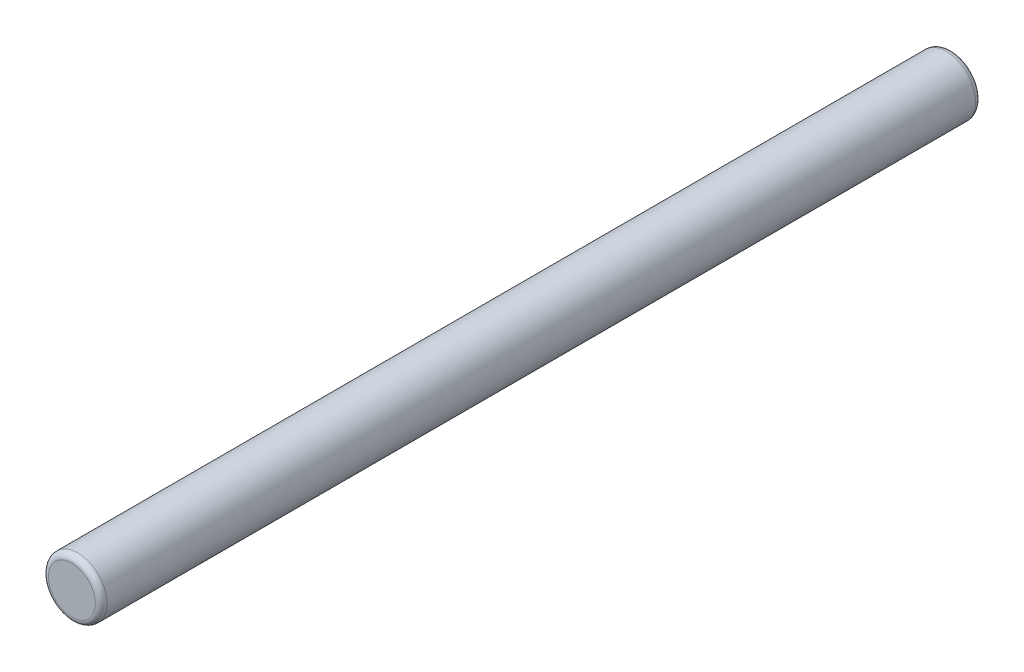
ISO-10303-21;
HEADER;
FILE_DESCRIPTION(('STEP AP214'),'2;1');
FILE_NAME('part.step','',(''),(''),'','','');
FILE_SCHEMA(('AUTOMOTIVE_DESIGN { 1 0 10303 214 1 1 1 1 }'));
ENDSEC;
DATA;
#1=APPLICATION_CONTEXT('core data for automotive mechanical design processes');
#2=APPLICATION_PROTOCOL_DEFINITION('international standard','automotive_design',2000,#1);
#3=PRODUCT_CONTEXT('',#1,'mechanical');
#4=PRODUCT('Part','Part','',(#3));
#5=PRODUCT_RELATED_PRODUCT_CATEGORY('part','',(#4));
#6=PRODUCT_DEFINITION_FORMATION('','',#4);
#7=PRODUCT_DEFINITION_CONTEXT('part definition',#1,'design');
#8=PRODUCT_DEFINITION('design','',#6,#7);
#9=PRODUCT_DEFINITION_SHAPE('','',#8);
#10=(LENGTH_UNIT() NAMED_UNIT(*) SI_UNIT(.MILLI.,.METRE.));
#11=(NAMED_UNIT(*) PLANE_ANGLE_UNIT() SI_UNIT($,.RADIAN.));
#12=(NAMED_UNIT(*) SI_UNIT($,.STERADIAN.) SOLID_ANGLE_UNIT());
#13=UNCERTAINTY_MEASURE_WITH_UNIT(LENGTH_MEASURE(1.E-05),#10,'distance_accuracy_value','');
#14=(GEOMETRIC_REPRESENTATION_CONTEXT(3) GLOBAL_UNCERTAINTY_ASSIGNED_CONTEXT((#13)) GLOBAL_UNIT_ASSIGNED_CONTEXT((#10,
#11,#12)) REPRESENTATION_CONTEXT('',''));
#15=CARTESIAN_POINT('',(0.,0.,0.));
#16=DIRECTION('',(0.,0.,1.));
#17=DIRECTION('',(1.,0.,0.));
#18=AXIS2_PLACEMENT_3D('',#15,#16,#17);
#19=CARTESIAN_POINT('',(0.,0.,30.));
#20=DIRECTION('',(0.,0.,-1.));
#21=DIRECTION('',(-1.,0.,0.));
#22=AXIS2_PLACEMENT_3D('',#19,#20,#21);
#23=CYLINDRICAL_SURFACE('',#22,1.);
#24=CARTESIAN_POINT('',(0.,0.,0.199999999999999));
#25=DIRECTION('',(0.,0.,1.));
#26=DIRECTION('',(1.,0.,0.));
#27=AXIS2_PLACEMENT_3D('',#24,#25,#26);
#28=CIRCLE('',#27,1.);
#29=CARTESIAN_POINT('',(1.,0.,0.199999999999999));
#30=VERTEX_POINT('',#29);
#31=EDGE_CURVE('E43',#30,#30,#28,.T.);
#32=ORIENTED_EDGE('',*,*,#31,.T.);
#33=EDGE_LOOP('',(#32));
#34=FACE_BOUND('',#33,.T.);
#35=CARTESIAN_POINT('',(0.,0.,29.8));
#36=DIRECTION('',(0.,0.,1.));
#37=DIRECTION('',(1.,0.,0.));
#38=AXIS2_PLACEMENT_3D('',#35,#36,#37);
#39=CIRCLE('',#38,1.);
#40=CARTESIAN_POINT('',(1.,0.,29.8));
#41=VERTEX_POINT('',#40);
#42=EDGE_CURVE('E47',#41,#41,#39,.F.);
#43=ORIENTED_EDGE('',*,*,#42,.T.);
#44=EDGE_LOOP('',(#43));
#45=FACE_BOUND('',#44,.T.);
#46=ADVANCED_FACE('F33',(#34,#45),#23,.T.);
#47=CARTESIAN_POINT('',(0.,0.,30.));
#48=DIRECTION('',(0.,0.,1.));
#49=DIRECTION('',(1.,0.,0.));
#50=AXIS2_PLACEMENT_3D('',#47,#48,#49);
#51=PLANE('',#50);
#52=CARTESIAN_POINT('',(0.,0.,30.));
#53=DIRECTION('',(0.,0.,1.));
#54=DIRECTION('',(1.,0.,0.));
#55=AXIS2_PLACEMENT_3D('',#52,#53,#54);
#56=CIRCLE('',#55,0.8);
#57=CARTESIAN_POINT('',(0.8,0.,30.));
#58=VERTEX_POINT('',#57);
#59=EDGE_CURVE('E10',#58,#58,#56,.T.);
#60=ORIENTED_EDGE('',*,*,#59,.T.);
#61=EDGE_LOOP('',(#60));
#62=FACE_BOUND('',#61,.T.);
#63=ADVANCED_FACE('F66',(#62),#51,.T.);
#64=CARTESIAN_POINT('',(0.,0.,0.));
#65=DIRECTION('',(0.,0.,1.));
#66=DIRECTION('',(1.,0.,0.));
#67=AXIS2_PLACEMENT_3D('',#64,#65,#66);
#68=PLANE('',#67);
#69=CARTESIAN_POINT('',(0.,0.,0.));
#70=DIRECTION('',(0.,0.,1.));
#71=DIRECTION('',(1.,0.,0.));
#72=AXIS2_PLACEMENT_3D('',#69,#70,#71);
#73=CIRCLE('',#72,0.8);
#74=CARTESIAN_POINT('',(0.8,0.,0.));
#75=VERTEX_POINT('',#74);
#76=EDGE_CURVE('E39',#75,#75,#73,.F.);
#77=ORIENTED_EDGE('',*,*,#76,.T.);
#78=EDGE_LOOP('',(#77));
#79=FACE_BOUND('',#78,.T.);
#80=ADVANCED_FACE('F62',(#79),#68,.F.);
#81=CARTESIAN_POINT('',(0.,0.,0.199999999999999));
#82=DIRECTION('',(0.,0.,1.));
#83=DIRECTION('',(1.,0.,0.));
#84=AXIS2_PLACEMENT_3D('',#81,#82,#83);
#85=TOROIDAL_SURFACE('',#84,0.8,0.2);
#86=ORIENTED_EDGE('',*,*,#76,.F.);
#87=EDGE_LOOP('',(#86));
#88=FACE_BOUND('',#87,.T.);
#89=ORIENTED_EDGE('',*,*,#31,.F.);
#90=EDGE_LOOP('',(#89));
#91=FACE_BOUND('',#90,.T.);
#92=ADVANCED_FACE('F57',(#88,#91),#85,.T.);
#93=CARTESIAN_POINT('',(0.,0.,29.8));
#94=DIRECTION('',(0.,0.,1.));
#95=DIRECTION('',(1.,0.,0.));
#96=AXIS2_PLACEMENT_3D('',#93,#94,#95);
#97=TOROIDAL_SURFACE('',#96,0.8,0.2);
#98=ORIENTED_EDGE('',*,*,#42,.F.);
#99=EDGE_LOOP('',(#98));
#100=FACE_BOUND('',#99,.T.);
#101=ORIENTED_EDGE('',*,*,#59,.F.);
#102=EDGE_LOOP('',(#101));
#103=FACE_BOUND('',#102,.T.);
#104=ADVANCED_FACE('F54',(#100,#103),#97,.T.);
#105=CLOSED_SHELL('',(#46,#63,#80,#92,#104));
#106=MANIFOLD_SOLID_BREP('B2',#105);
#107=ADVANCED_BREP_SHAPE_REPRESENTATION('',(#18,#106),#14);
#108=SHAPE_DEFINITION_REPRESENTATION(#9,#107);
ENDSEC;
END-ISO-10303-21;
